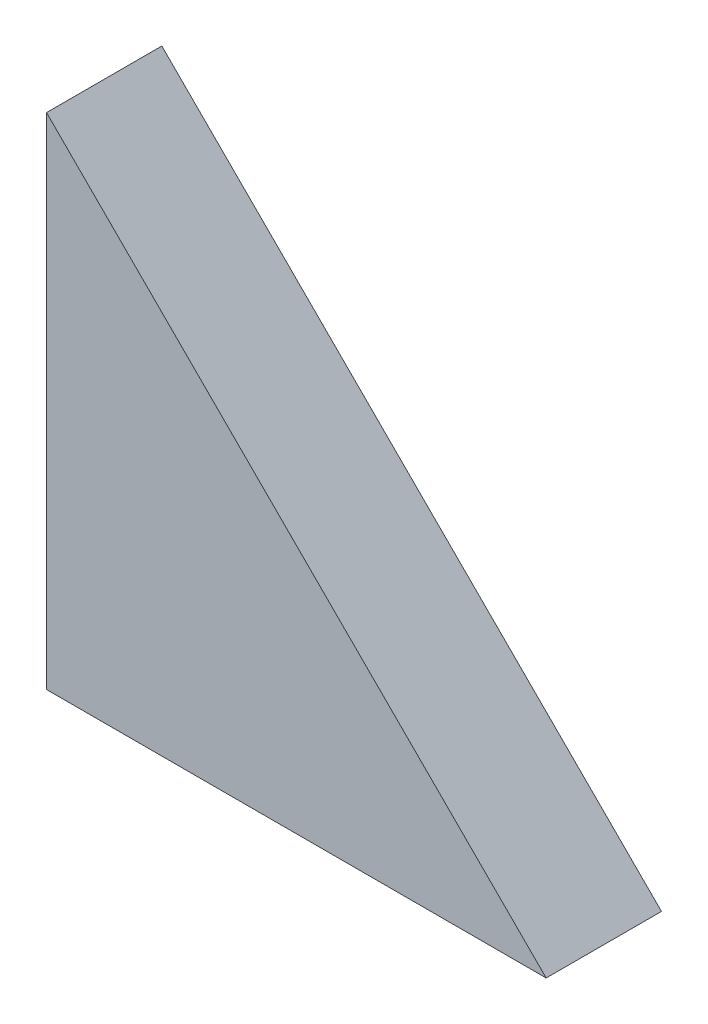
ISO-10303-21;
HEADER;
FILE_DESCRIPTION(('STEP AP214'),'2;1');
FILE_NAME('part.step','',(''),(''),'','','');
FILE_SCHEMA(('AUTOMOTIVE_DESIGN { 1 0 10303 214 1 1 1 1 }'));
ENDSEC;
DATA;
#1=APPLICATION_CONTEXT('core data for automotive mechanical design processes');
#2=APPLICATION_PROTOCOL_DEFINITION('international standard','automotive_design',2000,#1);
#3=PRODUCT_CONTEXT('',#1,'mechanical');
#4=PRODUCT('Part','Part','',(#3));
#5=PRODUCT_RELATED_PRODUCT_CATEGORY('part','',(#4));
#6=PRODUCT_DEFINITION_FORMATION('','',#4);
#7=PRODUCT_DEFINITION_CONTEXT('part definition',#1,'design');
#8=PRODUCT_DEFINITION('design','',#6,#7);
#9=PRODUCT_DEFINITION_SHAPE('','',#8);
#10=(LENGTH_UNIT() NAMED_UNIT(*) SI_UNIT(.MILLI.,.METRE.));
#11=(NAMED_UNIT(*) PLANE_ANGLE_UNIT() SI_UNIT($,.RADIAN.));
#12=(NAMED_UNIT(*) SI_UNIT($,.STERADIAN.) SOLID_ANGLE_UNIT());
#13=UNCERTAINTY_MEASURE_WITH_UNIT(LENGTH_MEASURE(1.E-05),#10,'distance_accuracy_value','');
#14=(GEOMETRIC_REPRESENTATION_CONTEXT(3) GLOBAL_UNCERTAINTY_ASSIGNED_CONTEXT((#13)) GLOBAL_UNIT_ASSIGNED_CONTEXT((#10,
#11,#12)) REPRESENTATION_CONTEXT('',''));
#15=CARTESIAN_POINT('',(0.,0.,0.));
#16=DIRECTION('',(0.,0.,1.));
#17=DIRECTION('',(1.,0.,0.));
#18=AXIS2_PLACEMENT_3D('',#15,#16,#17);
#19=CARTESIAN_POINT('',(165.099997208486,1.23376279184121E-12,38.1));
#20=DIRECTION('',(0.,1.,0.));
#21=DIRECTION('',(-1.,0.,0.));
#22=AXIS2_PLACEMENT_3D('',#19,#20,#21);
#23=PLANE('',#22);
#24=DIRECTION('',(1.,0.,0.));
#25=VECTOR('',#24,1.);
#26=CARTESIAN_POINT('',(165.099997208486,1.23376279184121E-12,0.));
#27=LINE('',#26,#25);
#28=CARTESIAN_POINT('',(0.,0.,0.));
#29=VERTEX_POINT('',#28);
#30=CARTESIAN_POINT('',(165.099997208486,1.23376279184121E-12,0.));
#31=VERTEX_POINT('',#30);
#32=EDGE_CURVE('E89',#29,#31,#27,.T.);
#33=ORIENTED_EDGE('',*,*,#32,.T.);
#34=DIRECTION('',(0.,0.,-1.));
#35=VECTOR('',#34,1.);
#36=CARTESIAN_POINT('',(165.099997208486,1.23376279184121E-12,38.1));
#37=LINE('',#36,#35);
#38=CARTESIAN_POINT('',(165.099997208486,1.23376279184121E-12,38.1));
#39=VERTEX_POINT('',#38);
#40=EDGE_CURVE('E11',#39,#31,#37,.T.);
#41=ORIENTED_EDGE('',*,*,#40,.F.);
#42=DIRECTION('',(1.,0.,0.));
#43=VECTOR('',#42,1.);
#44=CARTESIAN_POINT('',(165.099997208486,1.23376279184121E-12,38.1));
#45=LINE('',#44,#43);
#46=CARTESIAN_POINT('',(0.,0.,38.1));
#47=VERTEX_POINT('',#46);
#48=EDGE_CURVE('E81',#47,#39,#45,.T.);
#49=ORIENTED_EDGE('',*,*,#48,.F.);
#50=DIRECTION('',(0.,0.,-1.));
#51=VECTOR('',#50,1.);
#52=CARTESIAN_POINT('',(0.,0.,38.1));
#53=LINE('',#52,#51);
#54=EDGE_CURVE('E90',#47,#29,#53,.T.);
#55=ORIENTED_EDGE('',*,*,#54,.T.);
#56=EDGE_LOOP('',(#33,#41,#49,#55));
#57=FACE_BOUND('',#56,.T.);
#58=ADVANCED_FACE('F39',(#57),#23,.F.);
#59=CARTESIAN_POINT('',(-6.6185485490522E-13,165.099997208485,38.1));
#60=DIRECTION('',(-0.707106781186541,-0.707106781186554,0.));
#61=DIRECTION('',(0.707106781186554,-0.707106781186541,0.));
#62=AXIS2_PLACEMENT_3D('',#59,#60,#61);
#63=PLANE('',#62);
#64=DIRECTION('',(-0.707106781186554,0.707106781186541,0.));
#65=VECTOR('',#64,1.);
#66=CARTESIAN_POINT('',(-6.6185485490522E-13,165.099997208485,0.));
#67=LINE('',#66,#65);
#68=CARTESIAN_POINT('',(-6.6185485490522E-13,165.099997208485,0.));
#69=VERTEX_POINT('',#68);
#70=EDGE_CURVE('E68',#31,#69,#67,.T.);
#71=ORIENTED_EDGE('',*,*,#70,.T.);
#72=DIRECTION('',(0.,0.,-1.));
#73=VECTOR('',#72,1.);
#74=CARTESIAN_POINT('',(-6.6185485490522E-13,165.099997208485,38.1));
#75=LINE('',#74,#73);
#76=CARTESIAN_POINT('',(-6.6185485490522E-13,165.099997208485,38.1));
#77=VERTEX_POINT('',#76);
#78=EDGE_CURVE('E48',#77,#69,#75,.T.);
#79=ORIENTED_EDGE('',*,*,#78,.F.);
#80=DIRECTION('',(-0.707106781186554,0.707106781186541,0.));
#81=VECTOR('',#80,1.);
#82=CARTESIAN_POINT('',(-6.6185485490522E-13,165.099997208485,38.1));
#83=LINE('',#82,#81);
#84=EDGE_CURVE('E76',#39,#77,#83,.T.);
#85=ORIENTED_EDGE('',*,*,#84,.F.);
#86=ORIENTED_EDGE('',*,*,#40,.T.);
#87=EDGE_LOOP('',(#71,#79,#85,#86));
#88=FACE_BOUND('',#87,.T.);
#89=ADVANCED_FACE('F77',(#88),#63,.F.);
#90=CARTESIAN_POINT('',(0.,0.,38.1));
#91=DIRECTION('',(1.,0.,0.));
#92=DIRECTION('',(0.,1.,0.));
#93=AXIS2_PLACEMENT_3D('',#90,#91,#92);
#94=PLANE('',#93);
#95=DIRECTION('',(0.,-1.,0.));
#96=VECTOR('',#95,1.);
#97=CARTESIAN_POINT('',(0.,0.,0.));
#98=LINE('',#97,#96);
#99=EDGE_CURVE('E73',#69,#29,#98,.T.);
#100=ORIENTED_EDGE('',*,*,#99,.T.);
#101=ORIENTED_EDGE('',*,*,#54,.F.);
#102=DIRECTION('',(0.,-1.,0.));
#103=VECTOR('',#102,1.);
#104=CARTESIAN_POINT('',(0.,0.,38.1));
#105=LINE('',#104,#103);
#106=EDGE_CURVE('E56',#77,#47,#105,.T.);
#107=ORIENTED_EDGE('',*,*,#106,.F.);
#108=ORIENTED_EDGE('',*,*,#78,.T.);
#109=EDGE_LOOP('',(#100,#101,#107,#108));
#110=FACE_BOUND('',#109,.T.);
#111=ADVANCED_FACE('F102',(#110),#94,.F.);
#112=CARTESIAN_POINT('',(0.,0.,38.1));
#113=DIRECTION('',(0.,0.,-1.));
#114=DIRECTION('',(-1.,0.,0.));
#115=AXIS2_PLACEMENT_3D('',#112,#113,#114);
#116=PLANE('',#115);
#117=ORIENTED_EDGE('',*,*,#48,.T.);
#118=ORIENTED_EDGE('',*,*,#84,.T.);
#119=ORIENTED_EDGE('',*,*,#106,.T.);
#120=EDGE_LOOP('',(#117,#118,#119));
#121=FACE_BOUND('',#120,.T.);
#122=ADVANCED_FACE('F84',(#121),#116,.F.);
#123=CARTESIAN_POINT('',(0.,0.,0.));
#124=DIRECTION('',(0.,0.,-1.));
#125=DIRECTION('',(-1.,0.,0.));
#126=AXIS2_PLACEMENT_3D('',#123,#124,#125);
#127=PLANE('',#126);
#128=ORIENTED_EDGE('',*,*,#32,.F.);
#129=ORIENTED_EDGE('',*,*,#99,.F.);
#130=ORIENTED_EDGE('',*,*,#70,.F.);
#131=EDGE_LOOP('',(#128,#129,#130));
#132=FACE_BOUND('',#131,.T.);
#133=ADVANCED_FACE('F103',(#132),#127,.T.);
#134=CLOSED_SHELL('',(#58,#89,#111,#122,#133));
#135=MANIFOLD_SOLID_BREP('B2',#134);
#136=ADVANCED_BREP_SHAPE_REPRESENTATION('',(#18,#135),#14);
#137=SHAPE_DEFINITION_REPRESENTATION(#9,#136);
ENDSEC;
END-ISO-10303-21;
